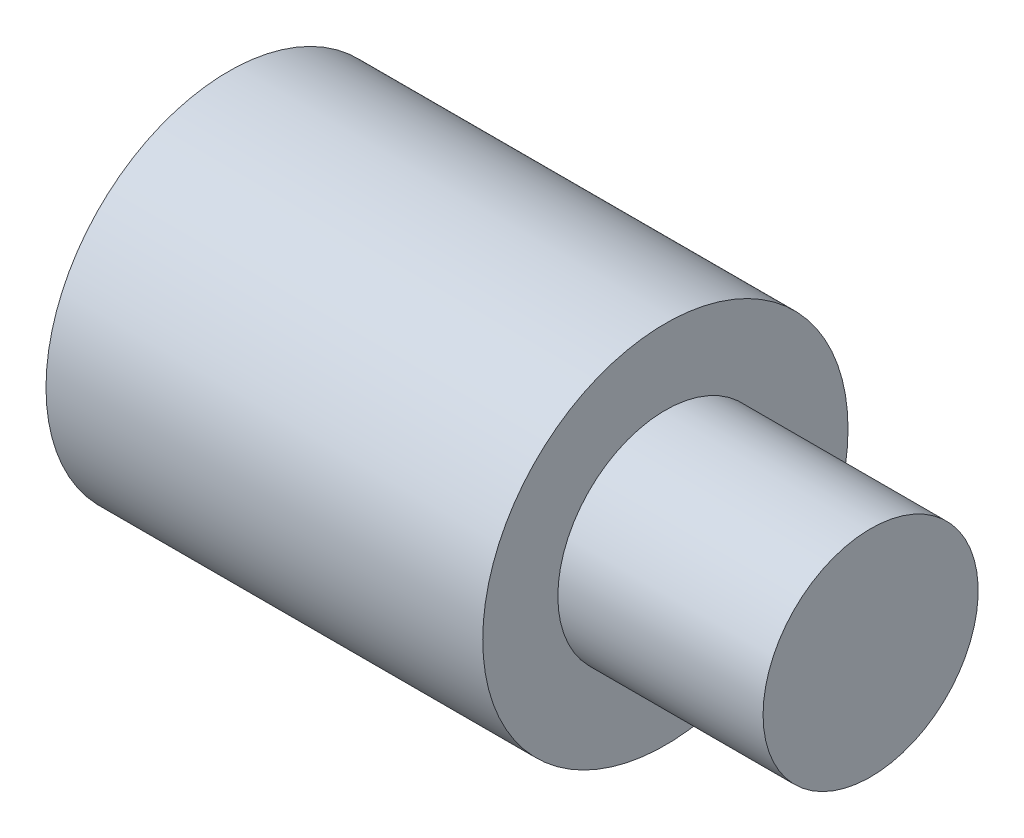
ISO-10303-21;
HEADER;
FILE_DESCRIPTION(('STEP AP214'),'2;1');
FILE_NAME('part.step','',(''),(''),'','','');
FILE_SCHEMA(('AUTOMOTIVE_DESIGN { 1 0 10303 214 1 1 1 1 }'));
ENDSEC;
DATA;
#1=APPLICATION_CONTEXT('core data for automotive mechanical design processes');
#2=APPLICATION_PROTOCOL_DEFINITION('international standard','automotive_design',2000,#1);
#3=PRODUCT_CONTEXT('',#1,'mechanical');
#4=PRODUCT('Part','Part','',(#3));
#5=PRODUCT_RELATED_PRODUCT_CATEGORY('part','',(#4));
#6=PRODUCT_DEFINITION_FORMATION('','',#4);
#7=PRODUCT_DEFINITION_CONTEXT('part definition',#1,'design');
#8=PRODUCT_DEFINITION('design','',#6,#7);
#9=PRODUCT_DEFINITION_SHAPE('','',#8);
#10=(LENGTH_UNIT() NAMED_UNIT(*) SI_UNIT(.MILLI.,.METRE.));
#11=(NAMED_UNIT(*) PLANE_ANGLE_UNIT() SI_UNIT($,.RADIAN.));
#12=(NAMED_UNIT(*) SI_UNIT($,.STERADIAN.) SOLID_ANGLE_UNIT());
#13=UNCERTAINTY_MEASURE_WITH_UNIT(LENGTH_MEASURE(1.E-05),#10,'distance_accuracy_value','');
#14=(GEOMETRIC_REPRESENTATION_CONTEXT(3) GLOBAL_UNCERTAINTY_ASSIGNED_CONTEXT((#13)) GLOBAL_UNIT_ASSIGNED_CONTEXT((#10,
#11,#12)) REPRESENTATION_CONTEXT('',''));
#15=CARTESIAN_POINT('',(0.,0.,0.));
#16=DIRECTION('',(0.,0.,1.));
#17=DIRECTION('',(1.,0.,0.));
#18=AXIS2_PLACEMENT_3D('',#15,#16,#17);
#19=CARTESIAN_POINT('',(12.5,0.,0.));
#20=DIRECTION('',(-1.,0.,0.));
#21=DIRECTION('',(0.,0.,1.));
#22=AXIS2_PLACEMENT_3D('',#19,#20,#21);
#23=PLANE('',#22);
#24=CARTESIAN_POINT('',(12.5,0.,0.));
#25=DIRECTION('',(-1.,0.,0.));
#26=DIRECTION('',(0.,0.,1.));
#27=AXIS2_PLACEMENT_3D('',#24,#25,#26);
#28=CIRCLE('',#27,6.55);
#29=CARTESIAN_POINT('',(12.5,0.,6.55));
#30=VERTEX_POINT('',#29);
#31=EDGE_CURVE('E10',#30,#30,#28,.T.);
#32=ORIENTED_EDGE('',*,*,#31,.F.);
#33=EDGE_LOOP('',(#32));
#34=FACE_BOUND('',#33,.T.);
#35=ADVANCED_FACE('F39',(#34),#23,.F.);
#36=CARTESIAN_POINT('',(-1000.,0.,0.));
#37=DIRECTION('',(-1.,0.,0.));
#38=DIRECTION('',(0.,0.,1.));
#39=AXIS2_PLACEMENT_3D('',#36,#37,#38);
#40=CYLINDRICAL_SURFACE('',#39,6.55);
#41=CARTESIAN_POINT('',(0.,0.,0.));
#42=DIRECTION('',(-1.,0.,0.));
#43=DIRECTION('',(0.,0.,1.));
#44=AXIS2_PLACEMENT_3D('',#41,#42,#43);
#45=CIRCLE('',#44,6.55);
#46=CARTESIAN_POINT('',(0.,0.,6.55));
#47=VERTEX_POINT('',#46);
#48=EDGE_CURVE('E46',#47,#47,#45,.T.);
#49=ORIENTED_EDGE('',*,*,#48,.F.);
#50=EDGE_LOOP('',(#49));
#51=FACE_BOUND('',#50,.T.);
#52=ORIENTED_EDGE('',*,*,#31,.T.);
#53=EDGE_LOOP('',(#52));
#54=FACE_BOUND('',#53,.T.);
#55=ADVANCED_FACE('F84',(#51,#54),#40,.T.);
#56=CARTESIAN_POINT('',(0.,6.55,0.));
#57=DIRECTION('',(-1.,0.,0.));
#58=DIRECTION('',(0.,0.,1.));
#59=AXIS2_PLACEMENT_3D('',#56,#57,#58);
#60=PLANE('',#59);
#61=CARTESIAN_POINT('',(0.,0.,0.));
#62=DIRECTION('',(-1.,0.,0.));
#63=DIRECTION('',(0.,0.,1.));
#64=AXIS2_PLACEMENT_3D('',#61,#62,#63);
#65=CIRCLE('',#64,11.124);
#66=CARTESIAN_POINT('',(0.,0.,11.124));
#67=VERTEX_POINT('',#66);
#68=EDGE_CURVE('E49',#67,#67,#65,.T.);
#69=ORIENTED_EDGE('',*,*,#68,.F.);
#70=EDGE_LOOP('',(#69));
#71=FACE_BOUND('',#70,.T.);
#72=ORIENTED_EDGE('',*,*,#48,.T.);
#73=EDGE_LOOP('',(#72));
#74=FACE_BOUND('',#73,.T.);
#75=ADVANCED_FACE('F76',(#71,#74),#60,.F.);
#76=CARTESIAN_POINT('',(-1000.,0.,0.));
#77=DIRECTION('',(-1.,0.,0.));
#78=DIRECTION('',(0.,0.,1.));
#79=AXIS2_PLACEMENT_3D('',#76,#77,#78);
#80=CYLINDRICAL_SURFACE('',#79,11.124);
#81=CARTESIAN_POINT('',(-26.6,0.,0.));
#82=DIRECTION('',(-1.,0.,0.));
#83=DIRECTION('',(0.,0.,1.));
#84=AXIS2_PLACEMENT_3D('',#81,#82,#83);
#85=CIRCLE('',#84,11.124);
#86=CARTESIAN_POINT('',(-26.6,0.,11.124));
#87=VERTEX_POINT('',#86);
#88=EDGE_CURVE('E54',#87,#87,#85,.T.);
#89=ORIENTED_EDGE('',*,*,#88,.F.);
#90=EDGE_LOOP('',(#89));
#91=FACE_BOUND('',#90,.T.);
#92=ORIENTED_EDGE('',*,*,#68,.T.);
#93=EDGE_LOOP('',(#92));
#94=FACE_BOUND('',#93,.T.);
#95=ADVANCED_FACE('F68',(#91,#94),#80,.T.);
#96=CARTESIAN_POINT('',(-26.6,11.124,0.));
#97=DIRECTION('',(1.,0.,0.));
#98=DIRECTION('',(0.,0.,-1.));
#99=AXIS2_PLACEMENT_3D('',#96,#97,#98);
#100=PLANE('',#99);
#101=CARTESIAN_POINT('',(-26.6,0.,0.));
#102=DIRECTION('',(1.,0.,0.));
#103=DIRECTION('',(0.,0.,-1.));
#104=AXIS2_PLACEMENT_3D('',#101,#102,#103);
#105=CIRCLE('',#104,6.35);
#106=CARTESIAN_POINT('',(-26.6,0.,-6.35));
#107=VERTEX_POINT('',#106);
#108=EDGE_CURVE('E45',#107,#107,#105,.F.);
#109=ORIENTED_EDGE('',*,*,#108,.F.);
#110=EDGE_LOOP('',(#109));
#111=FACE_BOUND('',#110,.T.);
#112=ORIENTED_EDGE('',*,*,#88,.T.);
#113=EDGE_LOOP('',(#112));
#114=FACE_BOUND('',#113,.T.);
#115=ADVANCED_FACE('F69',(#111,#114),#100,.F.);
#116=CARTESIAN_POINT('',(-1000.,0.,0.));
#117=DIRECTION('',(-1.,0.,0.));
#118=DIRECTION('',(0.,0.,1.));
#119=AXIS2_PLACEMENT_3D('',#116,#117,#118);
#120=CYLINDRICAL_SURFACE('',#119,6.35);
#121=CARTESIAN_POINT('',(-3.70000000000004,0.,0.));
#122=DIRECTION('',(-1.,0.,0.));
#123=DIRECTION('',(0.,0.,1.));
#124=AXIS2_PLACEMENT_3D('',#121,#122,#123);
#125=CIRCLE('',#124,6.35);
#126=CARTESIAN_POINT('',(-3.70000000000004,0.,6.35));
#127=VERTEX_POINT('',#126);
#128=EDGE_CURVE('E59',#127,#127,#125,.T.);
#129=ORIENTED_EDGE('',*,*,#128,.F.);
#130=EDGE_LOOP('',(#129));
#131=FACE_BOUND('',#130,.T.);
#132=ORIENTED_EDGE('',*,*,#108,.T.);
#133=EDGE_LOOP('',(#132));
#134=FACE_BOUND('',#133,.T.);
#135=ADVANCED_FACE('F64',(#131,#134),#120,.F.);
#136=CARTESIAN_POINT('',(-3.7,6.35,0.));
#137=DIRECTION('',(-1.,0.,0.));
#138=DIRECTION('',(0.,0.,1.));
#139=AXIS2_PLACEMENT_3D('',#136,#137,#138);
#140=PLANE('',#139);
#141=ORIENTED_EDGE('',*,*,#128,.T.);
#142=EDGE_LOOP('',(#141));
#143=FACE_BOUND('',#142,.T.);
#144=ADVANCED_FACE('F94',(#143),#140,.T.);
#145=CLOSED_SHELL('',(#35,#55,#75,#95,#115,#135,#144));
#146=MANIFOLD_SOLID_BREP('B2',#145);
#147=ADVANCED_BREP_SHAPE_REPRESENTATION('',(#18,#146),#14);
#148=SHAPE_DEFINITION_REPRESENTATION(#9,#147);
ENDSEC;
END-ISO-10303-21;
